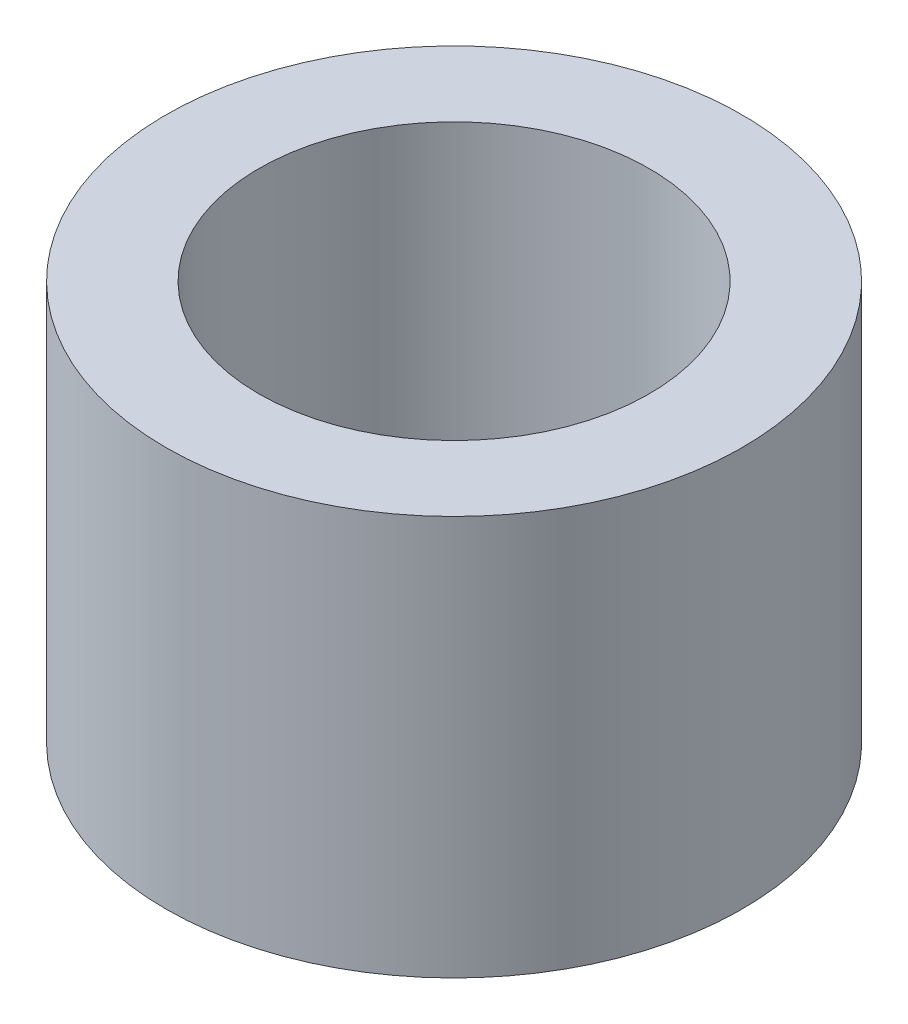
ISO-10303-21;
HEADER;
FILE_DESCRIPTION(('STEP AP214'),'2;1');
FILE_NAME('part.step','',(''),(''),'','','');
FILE_SCHEMA(('AUTOMOTIVE_DESIGN { 1 0 10303 214 1 1 1 1 }'));
ENDSEC;
DATA;
#1=APPLICATION_CONTEXT('core data for automotive mechanical design processes');
#2=APPLICATION_PROTOCOL_DEFINITION('international standard','automotive_design',2000,#1);
#3=PRODUCT_CONTEXT('',#1,'mechanical');
#4=PRODUCT('Part','Part','',(#3));
#5=PRODUCT_RELATED_PRODUCT_CATEGORY('part','',(#4));
#6=PRODUCT_DEFINITION_FORMATION('','',#4);
#7=PRODUCT_DEFINITION_CONTEXT('part definition',#1,'design');
#8=PRODUCT_DEFINITION('design','',#6,#7);
#9=PRODUCT_DEFINITION_SHAPE('','',#8);
#10=(LENGTH_UNIT() NAMED_UNIT(*) SI_UNIT(.MILLI.,.METRE.));
#11=(NAMED_UNIT(*) PLANE_ANGLE_UNIT() SI_UNIT($,.RADIAN.));
#12=(NAMED_UNIT(*) SI_UNIT($,.STERADIAN.) SOLID_ANGLE_UNIT());
#13=UNCERTAINTY_MEASURE_WITH_UNIT(LENGTH_MEASURE(1.E-05),#10,'distance_accuracy_value','');
#14=(GEOMETRIC_REPRESENTATION_CONTEXT(3) GLOBAL_UNCERTAINTY_ASSIGNED_CONTEXT((#13)) GLOBAL_UNIT_ASSIGNED_CONTEXT((#10,
#11,#12)) REPRESENTATION_CONTEXT('',''));
#15=CARTESIAN_POINT('',(0.,0.,0.));
#16=DIRECTION('',(0.,0.,1.));
#17=DIRECTION('',(1.,0.,0.));
#18=AXIS2_PLACEMENT_3D('',#15,#16,#17);
#19=CARTESIAN_POINT('',(0.,5.461,0.));
#20=DIRECTION('',(0.,1.,0.));
#21=DIRECTION('',(0.,0.,1.));
#22=AXIS2_PLACEMENT_3D('',#19,#20,#21);
#23=PLANE('',#22);
#24=CARTESIAN_POINT('',(0.,5.461,0.));
#25=DIRECTION('',(0.,1.,0.));
#26=DIRECTION('',(0.,0.,1.));
#27=AXIS2_PLACEMENT_3D('',#24,#25,#26);
#28=CIRCLE('',#27,3.937);
#29=CARTESIAN_POINT('',(0.,5.461,3.937));
#30=VERTEX_POINT('',#29);
#31=EDGE_CURVE('E10',#30,#30,#28,.T.);
#32=ORIENTED_EDGE('',*,*,#31,.T.);
#33=EDGE_LOOP('',(#32));
#34=FACE_BOUND('',#33,.T.);
#35=CARTESIAN_POINT('',(0.,5.461,0.));
#36=DIRECTION('',(0.,1.,0.));
#37=DIRECTION('',(0.,0.,1.));
#38=AXIS2_PLACEMENT_3D('',#35,#36,#37);
#39=CIRCLE('',#38,2.667);
#40=CARTESIAN_POINT('',(0.,5.461,2.667));
#41=VERTEX_POINT('',#40);
#42=EDGE_CURVE('E42',#41,#41,#39,.T.);
#43=ORIENTED_EDGE('',*,*,#42,.F.);
#44=EDGE_LOOP('',(#43));
#45=FACE_BOUND('',#44,.T.);
#46=ADVANCED_FACE('F31',(#34,#45),#23,.T.);
#47=CARTESIAN_POINT('',(0.,0.,0.));
#48=DIRECTION('',(0.,1.,0.));
#49=DIRECTION('',(0.,0.,1.));
#50=AXIS2_PLACEMENT_3D('',#47,#48,#49);
#51=PLANE('',#50);
#52=CARTESIAN_POINT('',(0.,0.,0.));
#53=DIRECTION('',(0.,1.,0.));
#54=DIRECTION('',(0.,0.,1.));
#55=AXIS2_PLACEMENT_3D('',#52,#53,#54);
#56=CIRCLE('',#55,3.937);
#57=CARTESIAN_POINT('',(0.,0.,3.937));
#58=VERTEX_POINT('',#57);
#59=EDGE_CURVE('E35',#58,#58,#56,.T.);
#60=ORIENTED_EDGE('',*,*,#59,.F.);
#61=EDGE_LOOP('',(#60));
#62=FACE_BOUND('',#61,.T.);
#63=CARTESIAN_POINT('',(0.,0.,0.));
#64=DIRECTION('',(0.,1.,0.));
#65=DIRECTION('',(0.,0.,1.));
#66=AXIS2_PLACEMENT_3D('',#63,#64,#65);
#67=CIRCLE('',#66,2.667);
#68=CARTESIAN_POINT('',(0.,0.,2.667));
#69=VERTEX_POINT('',#68);
#70=EDGE_CURVE('E44',#69,#69,#67,.T.);
#71=ORIENTED_EDGE('',*,*,#70,.T.);
#72=EDGE_LOOP('',(#71));
#73=FACE_BOUND('',#72,.T.);
#74=ADVANCED_FACE('F54',(#62,#73),#51,.F.);
#75=CARTESIAN_POINT('',(0.,5.461,0.));
#76=DIRECTION('',(0.,-1.,0.));
#77=DIRECTION('',(0.,0.,-1.));
#78=AXIS2_PLACEMENT_3D('',#75,#76,#77);
#79=CYLINDRICAL_SURFACE('',#78,3.937);
#80=ORIENTED_EDGE('',*,*,#31,.F.);
#81=EDGE_LOOP('',(#80));
#82=FACE_BOUND('',#81,.T.);
#83=ORIENTED_EDGE('',*,*,#59,.T.);
#84=EDGE_LOOP('',(#83));
#85=FACE_BOUND('',#84,.T.);
#86=ADVANCED_FACE('F33',(#82,#85),#79,.T.);
#87=CARTESIAN_POINT('',(0.,5.461,0.));
#88=DIRECTION('',(0.,-1.,0.));
#89=DIRECTION('',(0.,0.,-1.));
#90=AXIS2_PLACEMENT_3D('',#87,#88,#89);
#91=CYLINDRICAL_SURFACE('',#90,2.667);
#92=ORIENTED_EDGE('',*,*,#42,.T.);
#93=EDGE_LOOP('',(#92));
#94=FACE_BOUND('',#93,.T.);
#95=ORIENTED_EDGE('',*,*,#70,.F.);
#96=EDGE_LOOP('',(#95));
#97=FACE_BOUND('',#96,.T.);
#98=ADVANCED_FACE('F50',(#94,#97),#91,.F.);
#99=CLOSED_SHELL('',(#46,#74,#86,#98));
#100=MANIFOLD_SOLID_BREP('B2',#99);
#101=ADVANCED_BREP_SHAPE_REPRESENTATION('',(#18,#100),#14);
#102=SHAPE_DEFINITION_REPRESENTATION(#9,#101);
ENDSEC;
END-ISO-10303-21;
